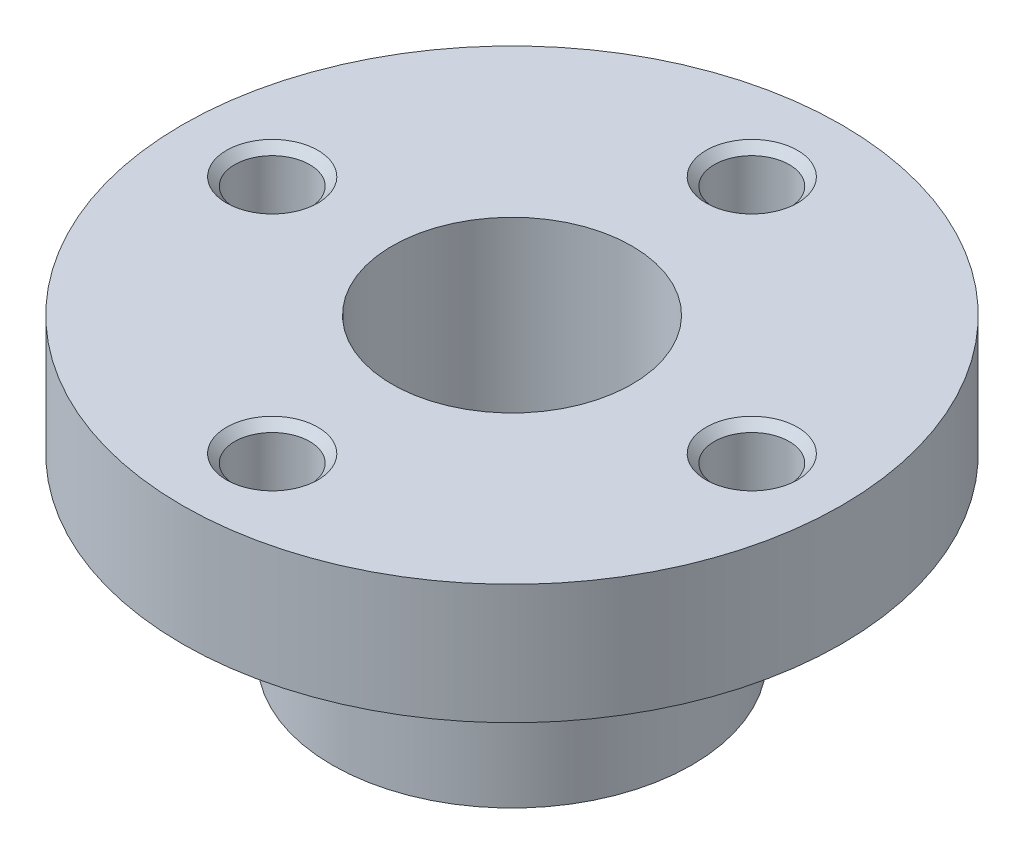
ISO-10303-21;
HEADER;
FILE_DESCRIPTION(('STEP AP214'),'2;1');
FILE_NAME('part.step','',(''),(''),'','','');
FILE_SCHEMA(('AUTOMOTIVE_DESIGN { 1 0 10303 214 1 1 1 1 }'));
ENDSEC;
DATA;
#1=APPLICATION_CONTEXT('core data for automotive mechanical design processes');
#2=APPLICATION_PROTOCOL_DEFINITION('international standard','automotive_design',2000,#1);
#3=PRODUCT_CONTEXT('',#1,'mechanical');
#4=PRODUCT('Part','Part','',(#3));
#5=PRODUCT_RELATED_PRODUCT_CATEGORY('part','',(#4));
#6=PRODUCT_DEFINITION_FORMATION('','',#4);
#7=PRODUCT_DEFINITION_CONTEXT('part definition',#1,'design');
#8=PRODUCT_DEFINITION('design','',#6,#7);
#9=PRODUCT_DEFINITION_SHAPE('','',#8);
#10=(LENGTH_UNIT() NAMED_UNIT(*) SI_UNIT(.MILLI.,.METRE.));
#11=(NAMED_UNIT(*) PLANE_ANGLE_UNIT() SI_UNIT($,.RADIAN.));
#12=(NAMED_UNIT(*) SI_UNIT($,.STERADIAN.) SOLID_ANGLE_UNIT());
#13=UNCERTAINTY_MEASURE_WITH_UNIT(LENGTH_MEASURE(1.E-05),#10,'distance_accuracy_value','');
#14=(GEOMETRIC_REPRESENTATION_CONTEXT(3) GLOBAL_UNCERTAINTY_ASSIGNED_CONTEXT((#13)) GLOBAL_UNIT_ASSIGNED_CONTEXT((#10,
#11,#12)) REPRESENTATION_CONTEXT('',''));
#15=CARTESIAN_POINT('',(0.,0.,0.));
#16=DIRECTION('',(0.,0.,1.));
#17=DIRECTION('',(1.,0.,0.));
#18=AXIS2_PLACEMENT_3D('',#15,#16,#17);
#19=CARTESIAN_POINT('',(6.,0.,0.));
#20=DIRECTION('',(0.,-1.,0.));
#21=DIRECTION('',(0.,0.,-1.));
#22=AXIS2_PLACEMENT_3D('',#19,#20,#21);
#23=PLANE('',#22);
#24=CARTESIAN_POINT('',(0.,0.,0.));
#25=DIRECTION('',(0.,-1.,0.));
#26=DIRECTION('',(0.,0.,-1.));
#27=AXIS2_PLACEMENT_3D('',#24,#25,#26);
#28=CIRCLE('',#27,6.);
#29=CARTESIAN_POINT('',(0.,0.,-6.));
#30=VERTEX_POINT('',#29);
#31=EDGE_CURVE('E50',#30,#30,#28,.T.);
#32=ORIENTED_EDGE('',*,*,#31,.T.);
#33=EDGE_LOOP('',(#32));
#34=FACE_BOUND('',#33,.T.);
#35=CARTESIAN_POINT('',(0.,0.,0.));
#36=DIRECTION('',(0.,-1.,0.));
#37=DIRECTION('',(0.,0.,-1.));
#38=AXIS2_PLACEMENT_3D('',#35,#36,#37);
#39=CIRCLE('',#38,4.);
#40=CARTESIAN_POINT('',(0.,0.,-4.));
#41=VERTEX_POINT('',#40);
#42=EDGE_CURVE('E10',#41,#41,#39,.T.);
#43=ORIENTED_EDGE('',*,*,#42,.F.);
#44=EDGE_LOOP('',(#43));
#45=FACE_BOUND('',#44,.T.);
#46=ADVANCED_FACE('F31',(#34,#45),#23,.T.);
#47=CARTESIAN_POINT('',(0.,0.,0.));
#48=DIRECTION('',(0.,-1.,0.));
#49=DIRECTION('',(0.,0.,-1.));
#50=AXIS2_PLACEMENT_3D('',#47,#48,#49);
#51=CYLINDRICAL_SURFACE('',#50,4.);
#52=ORIENTED_EDGE('',*,*,#42,.T.);
#53=EDGE_LOOP('',(#52));
#54=FACE_BOUND('',#53,.T.);
#55=CARTESIAN_POINT('',(0.,10.,0.));
#56=DIRECTION('',(0.,-1.,0.));
#57=DIRECTION('',(0.,0.,-1.));
#58=AXIS2_PLACEMENT_3D('',#55,#56,#57);
#59=CIRCLE('',#58,4.);
#60=CARTESIAN_POINT('',(0.,10.,-4.));
#61=VERTEX_POINT('',#60);
#62=EDGE_CURVE('E38',#61,#61,#59,.T.);
#63=ORIENTED_EDGE('',*,*,#62,.F.);
#64=EDGE_LOOP('',(#63));
#65=FACE_BOUND('',#64,.T.);
#66=ADVANCED_FACE('F94',(#54,#65),#51,.F.);
#67=CARTESIAN_POINT('',(4.,10.,0.));
#68=DIRECTION('',(0.,1.,0.));
#69=DIRECTION('',(0.,0.,1.));
#70=AXIS2_PLACEMENT_3D('',#67,#68,#69);
#71=PLANE('',#70);
#72=CARTESIAN_POINT('',(0.,10.,-8.));
#73=DIRECTION('',(0.,1.,0.));
#74=DIRECTION('',(0.,0.,1.));
#75=AXIS2_PLACEMENT_3D('',#72,#73,#74);
#76=CIRCLE('',#75,1.525);
#77=CARTESIAN_POINT('',(0.,10.,-6.475));
#78=VERTEX_POINT('',#77);
#79=EDGE_CURVE('E159',#78,#78,#76,.T.);
#80=ORIENTED_EDGE('',*,*,#79,.F.);
#81=EDGE_LOOP('',(#80));
#82=FACE_BOUND('',#81,.T.);
#83=CARTESIAN_POINT('',(8.,10.,0.));
#84=DIRECTION('',(0.,1.,0.));
#85=DIRECTION('',(0.,0.,1.));
#86=AXIS2_PLACEMENT_3D('',#83,#84,#85);
#87=CIRCLE('',#86,1.525);
#88=CARTESIAN_POINT('',(8.,10.,1.525));
#89=VERTEX_POINT('',#88);
#90=EDGE_CURVE('E65',#89,#89,#87,.T.);
#91=ORIENTED_EDGE('',*,*,#90,.F.);
#92=EDGE_LOOP('',(#91));
#93=FACE_BOUND('',#92,.T.);
#94=CARTESIAN_POINT('',(0.,10.,8.));
#95=DIRECTION('',(0.,1.,0.));
#96=DIRECTION('',(0.,0.,1.));
#97=AXIS2_PLACEMENT_3D('',#94,#95,#96);
#98=CIRCLE('',#97,1.525);
#99=CARTESIAN_POINT('',(0.,10.,9.525));
#100=VERTEX_POINT('',#99);
#101=EDGE_CURVE('E58',#100,#100,#98,.T.);
#102=ORIENTED_EDGE('',*,*,#101,.F.);
#103=EDGE_LOOP('',(#102));
#104=FACE_BOUND('',#103,.T.);
#105=CARTESIAN_POINT('',(-8.,10.,0.));
#106=DIRECTION('',(0.,1.,0.));
#107=DIRECTION('',(0.,0.,1.));
#108=AXIS2_PLACEMENT_3D('',#105,#106,#107);
#109=CIRCLE('',#108,1.525);
#110=CARTESIAN_POINT('',(-8.,10.,1.525));
#111=VERTEX_POINT('',#110);
#112=EDGE_CURVE('E54',#111,#111,#109,.T.);
#113=ORIENTED_EDGE('',*,*,#112,.F.);
#114=EDGE_LOOP('',(#113));
#115=FACE_BOUND('',#114,.T.);
#116=ORIENTED_EDGE('',*,*,#62,.T.);
#117=EDGE_LOOP('',(#116));
#118=FACE_BOUND('',#117,.T.);
#119=CARTESIAN_POINT('',(0.,10.,0.));
#120=DIRECTION('',(0.,-1.,0.));
#121=DIRECTION('',(0.,0.,-1.));
#122=AXIS2_PLACEMENT_3D('',#119,#120,#121);
#123=CIRCLE('',#122,11.);
#124=CARTESIAN_POINT('',(0.,10.,-11.));
#125=VERTEX_POINT('',#124);
#126=EDGE_CURVE('E43',#125,#125,#123,.T.);
#127=ORIENTED_EDGE('',*,*,#126,.F.);
#128=EDGE_LOOP('',(#127));
#129=FACE_BOUND('',#128,.T.);
#130=ADVANCED_FACE('F92',(#82,#93,#104,#115,#118,#129),#71,.T.);
#131=CARTESIAN_POINT('',(0.,0.,0.));
#132=DIRECTION('',(0.,-1.,0.));
#133=DIRECTION('',(0.,0.,-1.));
#134=AXIS2_PLACEMENT_3D('',#131,#132,#133);
#135=CYLINDRICAL_SURFACE('',#134,11.);
#136=ORIENTED_EDGE('',*,*,#126,.T.);
#137=EDGE_LOOP('',(#136));
#138=FACE_BOUND('',#137,.T.);
#139=CARTESIAN_POINT('',(0.,6.,0.));
#140=DIRECTION('',(0.,-1.,0.));
#141=DIRECTION('',(0.,0.,-1.));
#142=AXIS2_PLACEMENT_3D('',#139,#140,#141);
#143=CIRCLE('',#142,11.);
#144=CARTESIAN_POINT('',(0.,6.,-11.));
#145=VERTEX_POINT('',#144);
#146=EDGE_CURVE('E84',#145,#145,#143,.T.);
#147=ORIENTED_EDGE('',*,*,#146,.F.);
#148=EDGE_LOOP('',(#147));
#149=FACE_BOUND('',#148,.T.);
#150=ADVANCED_FACE('F89',(#138,#149),#135,.T.);
#151=CARTESIAN_POINT('',(11.,6.,0.));
#152=DIRECTION('',(0.,-1.,0.));
#153=DIRECTION('',(0.,0.,-1.));
#154=AXIS2_PLACEMENT_3D('',#151,#152,#153);
#155=PLANE('',#154);
#156=CARTESIAN_POINT('',(0.,6.,-8.));
#157=DIRECTION('',(0.,-1.,0.));
#158=DIRECTION('',(0.,0.,-1.));
#159=AXIS2_PLACEMENT_3D('',#156,#157,#158);
#160=CIRCLE('',#159,1.25);
#161=CARTESIAN_POINT('',(0.,6.,-9.25));
#162=VERTEX_POINT('',#161);
#163=EDGE_CURVE('E34',#162,#162,#160,.T.);
#164=ORIENTED_EDGE('',*,*,#163,.F.);
#165=EDGE_LOOP('',(#164));
#166=FACE_BOUND('',#165,.T.);
#167=CARTESIAN_POINT('',(8.,6.,0.));
#168=DIRECTION('',(0.,-1.,0.));
#169=DIRECTION('',(0.,0.,-1.));
#170=AXIS2_PLACEMENT_3D('',#167,#168,#169);
#171=CIRCLE('',#170,1.25);
#172=CARTESIAN_POINT('',(8.,6.,-1.25));
#173=VERTEX_POINT('',#172);
#174=EDGE_CURVE('E56',#173,#173,#171,.T.);
#175=ORIENTED_EDGE('',*,*,#174,.F.);
#176=EDGE_LOOP('',(#175));
#177=FACE_BOUND('',#176,.T.);
#178=CARTESIAN_POINT('',(0.,6.,8.));
#179=DIRECTION('',(0.,-1.,0.));
#180=DIRECTION('',(0.,0.,-1.));
#181=AXIS2_PLACEMENT_3D('',#178,#179,#180);
#182=CIRCLE('',#181,1.25);
#183=CARTESIAN_POINT('',(0.,6.,6.75));
#184=VERTEX_POINT('',#183);
#185=EDGE_CURVE('E52',#184,#184,#182,.T.);
#186=ORIENTED_EDGE('',*,*,#185,.F.);
#187=EDGE_LOOP('',(#186));
#188=FACE_BOUND('',#187,.T.);
#189=CARTESIAN_POINT('',(-8.,6.,0.));
#190=DIRECTION('',(0.,-1.,0.));
#191=DIRECTION('',(0.,0.,-1.));
#192=AXIS2_PLACEMENT_3D('',#189,#190,#191);
#193=CIRCLE('',#192,1.25);
#194=CARTESIAN_POINT('',(-8.,6.,-1.25));
#195=VERTEX_POINT('',#194);
#196=EDGE_CURVE('E47',#195,#195,#193,.T.);
#197=ORIENTED_EDGE('',*,*,#196,.F.);
#198=EDGE_LOOP('',(#197));
#199=FACE_BOUND('',#198,.T.);
#200=ORIENTED_EDGE('',*,*,#146,.T.);
#201=EDGE_LOOP('',(#200));
#202=FACE_BOUND('',#201,.T.);
#203=CARTESIAN_POINT('',(0.,6.,0.));
#204=DIRECTION('',(0.,-1.,0.));
#205=DIRECTION('',(0.,0.,-1.));
#206=AXIS2_PLACEMENT_3D('',#203,#204,#205);
#207=CIRCLE('',#206,6.);
#208=CARTESIAN_POINT('',(0.,6.,-6.));
#209=VERTEX_POINT('',#208);
#210=EDGE_CURVE('E81',#209,#209,#207,.T.);
#211=ORIENTED_EDGE('',*,*,#210,.F.);
#212=EDGE_LOOP('',(#211));
#213=FACE_BOUND('',#212,.T.);
#214=ADVANCED_FACE('F101',(#166,#177,#188,#199,#202,#213),#155,.T.);
#215=CARTESIAN_POINT('',(0.,0.,0.));
#216=DIRECTION('',(0.,-1.,0.));
#217=DIRECTION('',(0.,0.,-1.));
#218=AXIS2_PLACEMENT_3D('',#215,#216,#217);
#219=CYLINDRICAL_SURFACE('',#218,6.);
#220=ORIENTED_EDGE('',*,*,#210,.T.);
#221=EDGE_LOOP('',(#220));
#222=FACE_BOUND('',#221,.T.);
#223=ORIENTED_EDGE('',*,*,#31,.F.);
#224=EDGE_LOOP('',(#223));
#225=FACE_BOUND('',#224,.T.);
#226=ADVANCED_FACE('F112',(#222,#225),#219,.T.);
#227=CARTESIAN_POINT('',(-8.,10.,0.));
#228=DIRECTION('',(0.,1.,0.));
#229=DIRECTION('',(0.,0.,1.));
#230=AXIS2_PLACEMENT_3D('',#227,#228,#229);
#231=CYLINDRICAL_SURFACE('',#230,1.25);
#232=ORIENTED_EDGE('',*,*,#196,.T.);
#233=EDGE_LOOP('',(#232));
#234=FACE_BOUND('',#233,.T.);
#235=CARTESIAN_POINT('',(-8.,9.725,0.));
#236=DIRECTION('',(0.,1.,0.));
#237=DIRECTION('',(0.,0.,1.));
#238=AXIS2_PLACEMENT_3D('',#235,#236,#237);
#239=CIRCLE('',#238,1.25);
#240=CARTESIAN_POINT('',(-8.,9.725,1.25));
#241=VERTEX_POINT('',#240);
#242=EDGE_CURVE('E51',#241,#241,#239,.T.);
#243=ORIENTED_EDGE('',*,*,#242,.T.);
#244=EDGE_LOOP('',(#243));
#245=FACE_BOUND('',#244,.T.);
#246=ADVANCED_FACE('F114',(#234,#245),#231,.F.);
#247=CARTESIAN_POINT('',(-8.,10.,0.));
#248=DIRECTION('',(0.,1.,0.));
#249=DIRECTION('',(0.,0.,1.));
#250=AXIS2_PLACEMENT_3D('',#247,#248,#249);
#251=CONICAL_SURFACE('',#250,1.525,0.785398163397448);
#252=ORIENTED_EDGE('',*,*,#242,.F.);
#253=EDGE_LOOP('',(#252));
#254=FACE_BOUND('',#253,.T.);
#255=ORIENTED_EDGE('',*,*,#112,.T.);
#256=EDGE_LOOP('',(#255));
#257=FACE_BOUND('',#256,.T.);
#258=ADVANCED_FACE('F121',(#254,#257),#251,.F.);
#259=CARTESIAN_POINT('',(0.,10.,8.));
#260=DIRECTION('',(0.,1.,0.));
#261=DIRECTION('',(0.,0.,1.));
#262=AXIS2_PLACEMENT_3D('',#259,#260,#261);
#263=CYLINDRICAL_SURFACE('',#262,1.25);
#264=ORIENTED_EDGE('',*,*,#185,.T.);
#265=EDGE_LOOP('',(#264));
#266=FACE_BOUND('',#265,.T.);
#267=CARTESIAN_POINT('',(0.,9.725,8.));
#268=DIRECTION('',(0.,1.,0.));
#269=DIRECTION('',(0.,0.,1.));
#270=AXIS2_PLACEMENT_3D('',#267,#268,#269);
#271=CIRCLE('',#270,1.25);
#272=CARTESIAN_POINT('',(0.,9.725,9.25));
#273=VERTEX_POINT('',#272);
#274=EDGE_CURVE('E55',#273,#273,#271,.T.);
#275=ORIENTED_EDGE('',*,*,#274,.T.);
#276=EDGE_LOOP('',(#275));
#277=FACE_BOUND('',#276,.T.);
#278=ADVANCED_FACE('F129',(#266,#277),#263,.F.);
#279=CARTESIAN_POINT('',(0.,10.,8.));
#280=DIRECTION('',(0.,1.,0.));
#281=DIRECTION('',(0.,0.,1.));
#282=AXIS2_PLACEMENT_3D('',#279,#280,#281);
#283=CONICAL_SURFACE('',#282,1.525,0.785398163397448);
#284=ORIENTED_EDGE('',*,*,#274,.F.);
#285=EDGE_LOOP('',(#284));
#286=FACE_BOUND('',#285,.T.);
#287=ORIENTED_EDGE('',*,*,#101,.T.);
#288=EDGE_LOOP('',(#287));
#289=FACE_BOUND('',#288,.T.);
#290=ADVANCED_FACE('F133',(#286,#289),#283,.F.);
#291=CARTESIAN_POINT('',(8.,10.,0.));
#292=DIRECTION('',(0.,1.,0.));
#293=DIRECTION('',(0.,0.,1.));
#294=AXIS2_PLACEMENT_3D('',#291,#292,#293);
#295=CYLINDRICAL_SURFACE('',#294,1.25);
#296=ORIENTED_EDGE('',*,*,#174,.T.);
#297=EDGE_LOOP('',(#296));
#298=FACE_BOUND('',#297,.T.);
#299=CARTESIAN_POINT('',(8.,9.725,0.));
#300=DIRECTION('',(0.,1.,0.));
#301=DIRECTION('',(0.,0.,1.));
#302=AXIS2_PLACEMENT_3D('',#299,#300,#301);
#303=CIRCLE('',#302,1.25);
#304=CARTESIAN_POINT('',(8.,9.725,1.25));
#305=VERTEX_POINT('',#304);
#306=EDGE_CURVE('E59',#305,#305,#303,.T.);
#307=ORIENTED_EDGE('',*,*,#306,.T.);
#308=EDGE_LOOP('',(#307));
#309=FACE_BOUND('',#308,.T.);
#310=ADVANCED_FACE('F137',(#298,#309),#295,.F.);
#311=CARTESIAN_POINT('',(8.,10.,0.));
#312=DIRECTION('',(0.,1.,0.));
#313=DIRECTION('',(0.,0.,1.));
#314=AXIS2_PLACEMENT_3D('',#311,#312,#313);
#315=CONICAL_SURFACE('',#314,1.525,0.785398163397448);
#316=ORIENTED_EDGE('',*,*,#306,.F.);
#317=EDGE_LOOP('',(#316));
#318=FACE_BOUND('',#317,.T.);
#319=ORIENTED_EDGE('',*,*,#90,.T.);
#320=EDGE_LOOP('',(#319));
#321=FACE_BOUND('',#320,.T.);
#322=ADVANCED_FACE('F141',(#318,#321),#315,.F.);
#323=CARTESIAN_POINT('',(0.,10.,-8.));
#324=DIRECTION('',(0.,1.,0.));
#325=DIRECTION('',(0.,0.,1.));
#326=AXIS2_PLACEMENT_3D('',#323,#324,#325);
#327=CYLINDRICAL_SURFACE('',#326,1.25);
#328=ORIENTED_EDGE('',*,*,#163,.T.);
#329=EDGE_LOOP('',(#328));
#330=FACE_BOUND('',#329,.T.);
#331=CARTESIAN_POINT('',(0.,9.725,-8.));
#332=DIRECTION('',(0.,1.,0.));
#333=DIRECTION('',(0.,0.,1.));
#334=AXIS2_PLACEMENT_3D('',#331,#332,#333);
#335=CIRCLE('',#334,1.25);
#336=CARTESIAN_POINT('',(0.,9.725,-6.75));
#337=VERTEX_POINT('',#336);
#338=EDGE_CURVE('E157',#337,#337,#335,.T.);
#339=ORIENTED_EDGE('',*,*,#338,.T.);
#340=EDGE_LOOP('',(#339));
#341=FACE_BOUND('',#340,.T.);
#342=ADVANCED_FACE('F144',(#330,#341),#327,.F.);
#343=CARTESIAN_POINT('',(0.,10.,-8.));
#344=DIRECTION('',(0.,1.,0.));
#345=DIRECTION('',(0.,0.,1.));
#346=AXIS2_PLACEMENT_3D('',#343,#344,#345);
#347=CONICAL_SURFACE('',#346,1.525,0.785398163397448);
#348=ORIENTED_EDGE('',*,*,#338,.F.);
#349=EDGE_LOOP('',(#348));
#350=FACE_BOUND('',#349,.T.);
#351=ORIENTED_EDGE('',*,*,#79,.T.);
#352=EDGE_LOOP('',(#351));
#353=FACE_BOUND('',#352,.T.);
#354=ADVANCED_FACE('F148',(#350,#353),#347,.F.);
#355=CLOSED_SHELL('',(#46,#66,#130,#150,#214,#226,#246,#258,#278,#290,#310,#322,#342,#354));
#356=MANIFOLD_SOLID_BREP('B2',#355);
#357=ADVANCED_BREP_SHAPE_REPRESENTATION('',(#18,#356),#14);
#358=SHAPE_DEFINITION_REPRESENTATION(#9,#357);
ENDSEC;
END-ISO-10303-21;
